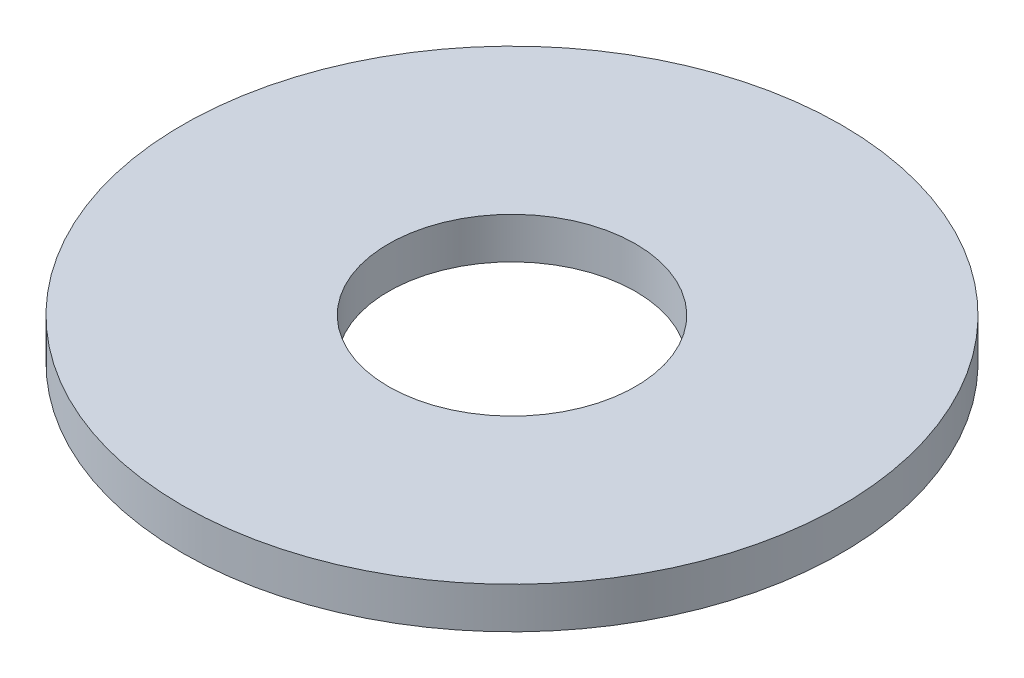
ISO-10303-21;
HEADER;
FILE_DESCRIPTION(('STEP AP214'),'2;1');
FILE_NAME('part.step','',(''),(''),'','','');
FILE_SCHEMA(('AUTOMOTIVE_DESIGN { 1 0 10303 214 1 1 1 1 }'));
ENDSEC;
DATA;
#1=APPLICATION_CONTEXT('core data for automotive mechanical design processes');
#2=APPLICATION_PROTOCOL_DEFINITION('international standard','automotive_design',2000,#1);
#3=PRODUCT_CONTEXT('',#1,'mechanical');
#4=PRODUCT('Part','Part','',(#3));
#5=PRODUCT_RELATED_PRODUCT_CATEGORY('part','',(#4));
#6=PRODUCT_DEFINITION_FORMATION('','',#4);
#7=PRODUCT_DEFINITION_CONTEXT('part definition',#1,'design');
#8=PRODUCT_DEFINITION('design','',#6,#7);
#9=PRODUCT_DEFINITION_SHAPE('','',#8);
#10=(LENGTH_UNIT() NAMED_UNIT(*) SI_UNIT(.MILLI.,.METRE.));
#11=(NAMED_UNIT(*) PLANE_ANGLE_UNIT() SI_UNIT($,.RADIAN.));
#12=(NAMED_UNIT(*) SI_UNIT($,.STERADIAN.) SOLID_ANGLE_UNIT());
#13=UNCERTAINTY_MEASURE_WITH_UNIT(LENGTH_MEASURE(1.E-05),#10,'distance_accuracy_value','');
#14=(GEOMETRIC_REPRESENTATION_CONTEXT(3) GLOBAL_UNCERTAINTY_ASSIGNED_CONTEXT((#13)) GLOBAL_UNIT_ASSIGNED_CONTEXT((#10,
#11,#12)) REPRESENTATION_CONTEXT('',''));
#15=CARTESIAN_POINT('',(0.,0.,0.));
#16=DIRECTION('',(0.,0.,1.));
#17=DIRECTION('',(1.,0.,0.));
#18=AXIS2_PLACEMENT_3D('',#15,#16,#17);
#19=CARTESIAN_POINT('',(0.,0.5,0.));
#20=DIRECTION('',(0.,1.,0.));
#21=DIRECTION('',(0.,0.,1.));
#22=AXIS2_PLACEMENT_3D('',#19,#20,#21);
#23=PLANE('',#22);
#24=CARTESIAN_POINT('',(0.,0.5,0.));
#25=DIRECTION('',(0.,1.,0.));
#26=DIRECTION('',(0.,0.,1.));
#27=AXIS2_PLACEMENT_3D('',#24,#25,#26);
#28=CIRCLE('',#27,4.);
#29=CARTESIAN_POINT('',(0.,0.5,4.));
#30=VERTEX_POINT('',#29);
#31=EDGE_CURVE('E10',#30,#30,#28,.T.);
#32=ORIENTED_EDGE('',*,*,#31,.T.);
#33=EDGE_LOOP('',(#32));
#34=FACE_BOUND('',#33,.T.);
#35=CARTESIAN_POINT('',(0.,0.5,0.));
#36=DIRECTION('',(0.,1.,0.));
#37=DIRECTION('',(0.,0.,1.));
#38=AXIS2_PLACEMENT_3D('',#35,#36,#37);
#39=CIRCLE('',#38,1.5);
#40=CARTESIAN_POINT('',(0.,0.5,1.5));
#41=VERTEX_POINT('',#40);
#42=EDGE_CURVE('E43',#41,#41,#39,.T.);
#43=ORIENTED_EDGE('',*,*,#42,.F.);
#44=EDGE_LOOP('',(#43));
#45=FACE_BOUND('',#44,.T.);
#46=ADVANCED_FACE('F32',(#34,#45),#23,.T.);
#47=CARTESIAN_POINT('',(0.,0.,0.));
#48=DIRECTION('',(0.,1.,0.));
#49=DIRECTION('',(0.,0.,1.));
#50=AXIS2_PLACEMENT_3D('',#47,#48,#49);
#51=PLANE('',#50);
#52=CARTESIAN_POINT('',(0.,0.,0.));
#53=DIRECTION('',(0.,1.,0.));
#54=DIRECTION('',(0.,0.,1.));
#55=AXIS2_PLACEMENT_3D('',#52,#53,#54);
#56=CIRCLE('',#55,4.);
#57=CARTESIAN_POINT('',(0.,0.,4.));
#58=VERTEX_POINT('',#57);
#59=EDGE_CURVE('E36',#58,#58,#56,.T.);
#60=ORIENTED_EDGE('',*,*,#59,.F.);
#61=EDGE_LOOP('',(#60));
#62=FACE_BOUND('',#61,.T.);
#63=CARTESIAN_POINT('',(0.,0.,0.));
#64=DIRECTION('',(0.,1.,0.));
#65=DIRECTION('',(0.,0.,1.));
#66=AXIS2_PLACEMENT_3D('',#63,#64,#65);
#67=CIRCLE('',#66,1.5);
#68=CARTESIAN_POINT('',(0.,0.,1.5));
#69=VERTEX_POINT('',#68);
#70=EDGE_CURVE('E45',#69,#69,#67,.T.);
#71=ORIENTED_EDGE('',*,*,#70,.T.);
#72=EDGE_LOOP('',(#71));
#73=FACE_BOUND('',#72,.T.);
#74=ADVANCED_FACE('F55',(#62,#73),#51,.F.);
#75=CARTESIAN_POINT('',(0.,0.5,0.));
#76=DIRECTION('',(0.,-1.,0.));
#77=DIRECTION('',(0.,0.,-1.));
#78=AXIS2_PLACEMENT_3D('',#75,#76,#77);
#79=CYLINDRICAL_SURFACE('',#78,4.);
#80=ORIENTED_EDGE('',*,*,#31,.F.);
#81=EDGE_LOOP('',(#80));
#82=FACE_BOUND('',#81,.T.);
#83=ORIENTED_EDGE('',*,*,#59,.T.);
#84=EDGE_LOOP('',(#83));
#85=FACE_BOUND('',#84,.T.);
#86=ADVANCED_FACE('F34',(#82,#85),#79,.T.);
#87=CARTESIAN_POINT('',(0.,0.5,0.));
#88=DIRECTION('',(0.,-1.,0.));
#89=DIRECTION('',(0.,0.,-1.));
#90=AXIS2_PLACEMENT_3D('',#87,#88,#89);
#91=CYLINDRICAL_SURFACE('',#90,1.5);
#92=ORIENTED_EDGE('',*,*,#42,.T.);
#93=EDGE_LOOP('',(#92));
#94=FACE_BOUND('',#93,.T.);
#95=ORIENTED_EDGE('',*,*,#70,.F.);
#96=EDGE_LOOP('',(#95));
#97=FACE_BOUND('',#96,.T.);
#98=ADVANCED_FACE('F51',(#94,#97),#91,.F.);
#99=CLOSED_SHELL('',(#46,#74,#86,#98));
#100=MANIFOLD_SOLID_BREP('B2',#99);
#101=ADVANCED_BREP_SHAPE_REPRESENTATION('',(#18,#100),#14);
#102=SHAPE_DEFINITION_REPRESENTATION(#9,#101);
ENDSEC;
END-ISO-10303-21;
